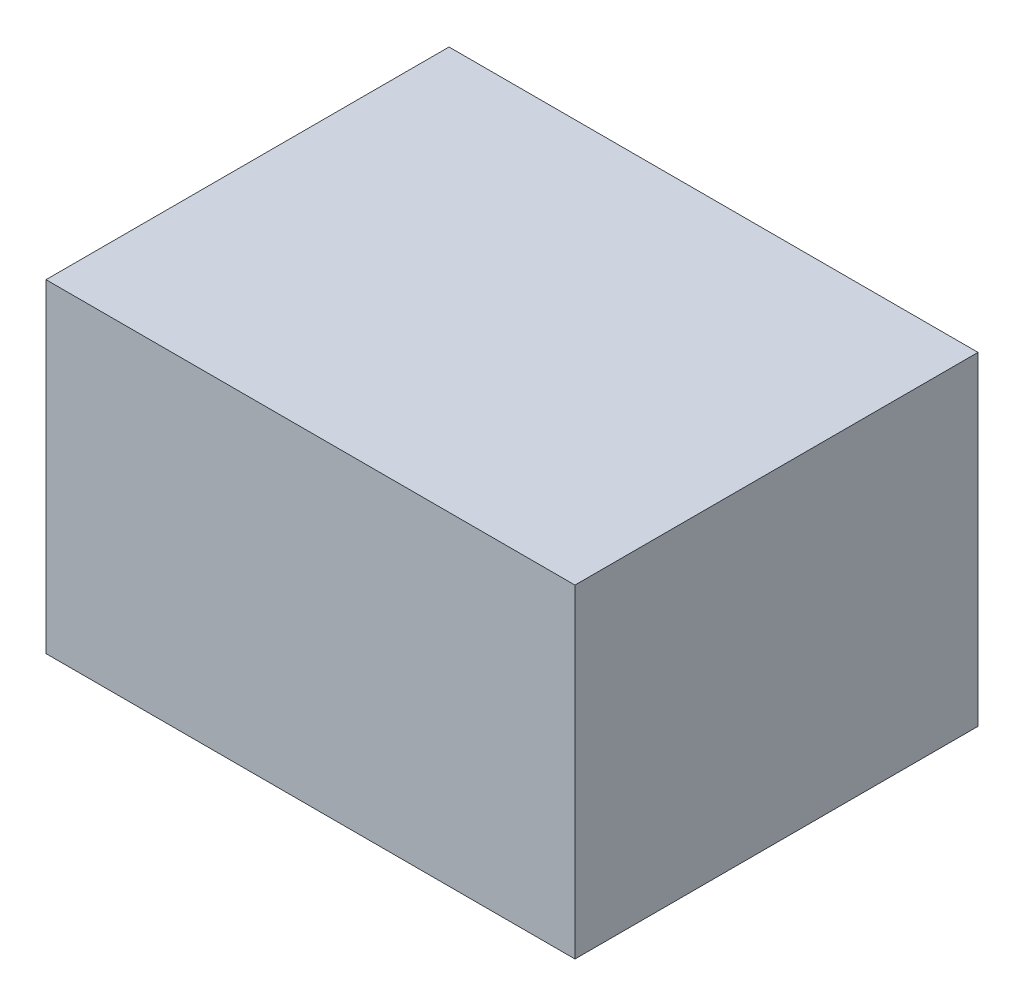
ISO-10303-21;
HEADER;
FILE_DESCRIPTION(('STEP AP214'),'2;1');
FILE_NAME('part.step','',(''),(''),'','','');
FILE_SCHEMA(('AUTOMOTIVE_DESIGN { 1 0 10303 214 1 1 1 1 }'));
ENDSEC;
DATA;
#1=APPLICATION_CONTEXT('core data for automotive mechanical design processes');
#2=APPLICATION_PROTOCOL_DEFINITION('international standard','automotive_design',2000,#1);
#3=PRODUCT_CONTEXT('',#1,'mechanical');
#4=PRODUCT('Part','Part','',(#3));
#5=PRODUCT_RELATED_PRODUCT_CATEGORY('part','',(#4));
#6=PRODUCT_DEFINITION_FORMATION('','',#4);
#7=PRODUCT_DEFINITION_CONTEXT('part definition',#1,'design');
#8=PRODUCT_DEFINITION('design','',#6,#7);
#9=PRODUCT_DEFINITION_SHAPE('','',#8);
#10=(LENGTH_UNIT() NAMED_UNIT(*) SI_UNIT(.MILLI.,.METRE.));
#11=(NAMED_UNIT(*) PLANE_ANGLE_UNIT() SI_UNIT($,.RADIAN.));
#12=(NAMED_UNIT(*) SI_UNIT($,.STERADIAN.) SOLID_ANGLE_UNIT());
#13=UNCERTAINTY_MEASURE_WITH_UNIT(LENGTH_MEASURE(1.E-05),#10,'distance_accuracy_value','');
#14=(GEOMETRIC_REPRESENTATION_CONTEXT(3) GLOBAL_UNCERTAINTY_ASSIGNED_CONTEXT((#13)) GLOBAL_UNIT_ASSIGNED_CONTEXT((#10,
#11,#12)) REPRESENTATION_CONTEXT('',''));
#15=CARTESIAN_POINT('',(0.,0.,0.));
#16=DIRECTION('',(0.,0.,1.));
#17=DIRECTION('',(1.,0.,0.));
#18=AXIS2_PLACEMENT_3D('',#15,#16,#17);
#19=CARTESIAN_POINT('',(186.69,114.3,142.24));
#20=DIRECTION('',(-1.,0.,0.));
#21=DIRECTION('',(0.,0.,1.));
#22=AXIS2_PLACEMENT_3D('',#19,#20,#21);
#23=PLANE('',#22);
#24=DIRECTION('',(0.,0.,-1.));
#25=VECTOR('',#24,1.);
#26=CARTESIAN_POINT('',(186.69,-114.3,142.24));
#27=LINE('',#26,#25);
#28=CARTESIAN_POINT('',(186.69,-114.3,142.24));
#29=VERTEX_POINT('',#28);
#30=CARTESIAN_POINT('',(186.69,-114.3,-142.24));
#31=VERTEX_POINT('',#30);
#32=EDGE_CURVE('E98',#29,#31,#27,.T.);
#33=ORIENTED_EDGE('',*,*,#32,.T.);
#34=DIRECTION('',(0.,-1.,0.));
#35=VECTOR('',#34,1.);
#36=CARTESIAN_POINT('',(186.69,114.3,-142.24));
#37=LINE('',#36,#35);
#38=CARTESIAN_POINT('',(186.69,114.3,-142.24));
#39=VERTEX_POINT('',#38);
#40=EDGE_CURVE('E11',#39,#31,#37,.T.);
#41=ORIENTED_EDGE('',*,*,#40,.F.);
#42=DIRECTION('',(0.,0.,-1.));
#43=VECTOR('',#42,1.);
#44=CARTESIAN_POINT('',(186.69,114.3,142.24));
#45=LINE('',#44,#43);
#46=CARTESIAN_POINT('',(186.69,114.3,142.24));
#47=VERTEX_POINT('',#46);
#48=EDGE_CURVE('E86',#47,#39,#45,.T.);
#49=ORIENTED_EDGE('',*,*,#48,.F.);
#50=DIRECTION('',(0.,-1.,0.));
#51=VECTOR('',#50,1.);
#52=CARTESIAN_POINT('',(186.69,114.3,142.24));
#53=LINE('',#52,#51);
#54=EDGE_CURVE('E94',#47,#29,#53,.T.);
#55=ORIENTED_EDGE('',*,*,#54,.T.);
#56=EDGE_LOOP('',(#33,#41,#49,#55));
#57=FACE_BOUND('',#56,.T.);
#58=ADVANCED_FACE('F35',(#57),#23,.F.);
#59=CARTESIAN_POINT('',(-186.69,114.3,-142.24));
#60=DIRECTION('',(0.,0.,1.));
#61=DIRECTION('',(1.,0.,0.));
#62=AXIS2_PLACEMENT_3D('',#59,#60,#61);
#63=PLANE('',#62);
#64=DIRECTION('',(-1.,0.,0.));
#65=VECTOR('',#64,1.);
#66=CARTESIAN_POINT('',(-186.69,-114.3,-142.24));
#67=LINE('',#66,#65);
#68=CARTESIAN_POINT('',(-186.69,-114.3,-142.24));
#69=VERTEX_POINT('',#68);
#70=EDGE_CURVE('E90',#31,#69,#67,.T.);
#71=ORIENTED_EDGE('',*,*,#70,.T.);
#72=DIRECTION('',(0.,-1.,0.));
#73=VECTOR('',#72,1.);
#74=CARTESIAN_POINT('',(-186.69,114.3,-142.24));
#75=LINE('',#74,#73);
#76=CARTESIAN_POINT('',(-186.69,114.3,-142.24));
#77=VERTEX_POINT('',#76);
#78=EDGE_CURVE('E43',#77,#69,#75,.T.);
#79=ORIENTED_EDGE('',*,*,#78,.F.);
#80=DIRECTION('',(-1.,0.,0.));
#81=VECTOR('',#80,1.);
#82=CARTESIAN_POINT('',(-186.69,114.3,-142.24));
#83=LINE('',#82,#81);
#84=EDGE_CURVE('E81',#39,#77,#83,.T.);
#85=ORIENTED_EDGE('',*,*,#84,.F.);
#86=ORIENTED_EDGE('',*,*,#40,.T.);
#87=EDGE_LOOP('',(#71,#79,#85,#86));
#88=FACE_BOUND('',#87,.T.);
#89=ADVANCED_FACE('F89',(#88),#63,.F.);
#90=CARTESIAN_POINT('',(-186.69,114.3,142.24));
#91=DIRECTION('',(1.,0.,0.));
#92=DIRECTION('',(0.,0.,-1.));
#93=AXIS2_PLACEMENT_3D('',#90,#91,#92);
#94=PLANE('',#93);
#95=DIRECTION('',(0.,0.,1.));
#96=VECTOR('',#95,1.);
#97=CARTESIAN_POINT('',(-186.69,-114.3,142.24));
#98=LINE('',#97,#96);
#99=CARTESIAN_POINT('',(-186.69,-114.3,142.24));
#100=VERTEX_POINT('',#99);
#101=EDGE_CURVE('E68',#69,#100,#98,.T.);
#102=ORIENTED_EDGE('',*,*,#101,.T.);
#103=DIRECTION('',(0.,-1.,0.));
#104=VECTOR('',#103,1.);
#105=CARTESIAN_POINT('',(-186.69,114.3,142.24));
#106=LINE('',#105,#104);
#107=CARTESIAN_POINT('',(-186.69,114.3,142.24));
#108=VERTEX_POINT('',#107);
#109=EDGE_CURVE('E91',#108,#100,#106,.T.);
#110=ORIENTED_EDGE('',*,*,#109,.F.);
#111=DIRECTION('',(0.,0.,1.));
#112=VECTOR('',#111,1.);
#113=CARTESIAN_POINT('',(-186.69,114.3,142.24));
#114=LINE('',#113,#112);
#115=EDGE_CURVE('E84',#77,#108,#114,.T.);
#116=ORIENTED_EDGE('',*,*,#115,.F.);
#117=ORIENTED_EDGE('',*,*,#78,.T.);
#118=EDGE_LOOP('',(#102,#110,#116,#117));
#119=FACE_BOUND('',#118,.T.);
#120=ADVANCED_FACE('F92',(#119),#94,.F.);
#121=CARTESIAN_POINT('',(-186.69,114.3,142.24));
#122=DIRECTION('',(0.,0.,-1.));
#123=DIRECTION('',(-1.,0.,0.));
#124=AXIS2_PLACEMENT_3D('',#121,#122,#123);
#125=PLANE('',#124);
#126=DIRECTION('',(1.,0.,0.));
#127=VECTOR('',#126,1.);
#128=CARTESIAN_POINT('',(-186.69,-114.3,142.24));
#129=LINE('',#128,#127);
#130=EDGE_CURVE('E74',#100,#29,#129,.T.);
#131=ORIENTED_EDGE('',*,*,#130,.T.);
#132=ORIENTED_EDGE('',*,*,#54,.F.);
#133=DIRECTION('',(1.,0.,0.));
#134=VECTOR('',#133,1.);
#135=CARTESIAN_POINT('',(-186.69,114.3,142.24));
#136=LINE('',#135,#134);
#137=EDGE_CURVE('E51',#108,#47,#136,.T.);
#138=ORIENTED_EDGE('',*,*,#137,.F.);
#139=ORIENTED_EDGE('',*,*,#109,.T.);
#140=EDGE_LOOP('',(#131,#132,#138,#139));
#141=FACE_BOUND('',#140,.T.);
#142=ADVANCED_FACE('F105',(#141),#125,.F.);
#143=CARTESIAN_POINT('',(0.,114.3,0.));
#144=DIRECTION('',(0.,-1.,0.));
#145=DIRECTION('',(0.,0.,-1.));
#146=AXIS2_PLACEMENT_3D('',#143,#144,#145);
#147=PLANE('',#146);
#148=ORIENTED_EDGE('',*,*,#48,.T.);
#149=ORIENTED_EDGE('',*,*,#84,.T.);
#150=ORIENTED_EDGE('',*,*,#115,.T.);
#151=ORIENTED_EDGE('',*,*,#137,.T.);
#152=EDGE_LOOP('',(#148,#149,#150,#151));
#153=FACE_BOUND('',#152,.T.);
#154=ADVANCED_FACE('F82',(#153),#147,.F.);
#155=CARTESIAN_POINT('',(0.,-114.3,0.));
#156=DIRECTION('',(0.,-1.,0.));
#157=DIRECTION('',(0.,0.,-1.));
#158=AXIS2_PLACEMENT_3D('',#155,#156,#157);
#159=PLANE('',#158);
#160=ORIENTED_EDGE('',*,*,#32,.F.);
#161=ORIENTED_EDGE('',*,*,#130,.F.);
#162=ORIENTED_EDGE('',*,*,#101,.F.);
#163=ORIENTED_EDGE('',*,*,#70,.F.);
#164=EDGE_LOOP('',(#160,#161,#162,#163));
#165=FACE_BOUND('',#164,.T.);
#166=ADVANCED_FACE('F108',(#165),#159,.T.);
#167=CLOSED_SHELL('',(#58,#89,#120,#142,#154,#166));
#168=MANIFOLD_SOLID_BREP('B2',#167);
#169=ADVANCED_BREP_SHAPE_REPRESENTATION('',(#18,#168),#14);
#170=SHAPE_DEFINITION_REPRESENTATION(#9,#169);
ENDSEC;
END-ISO-10303-21;
